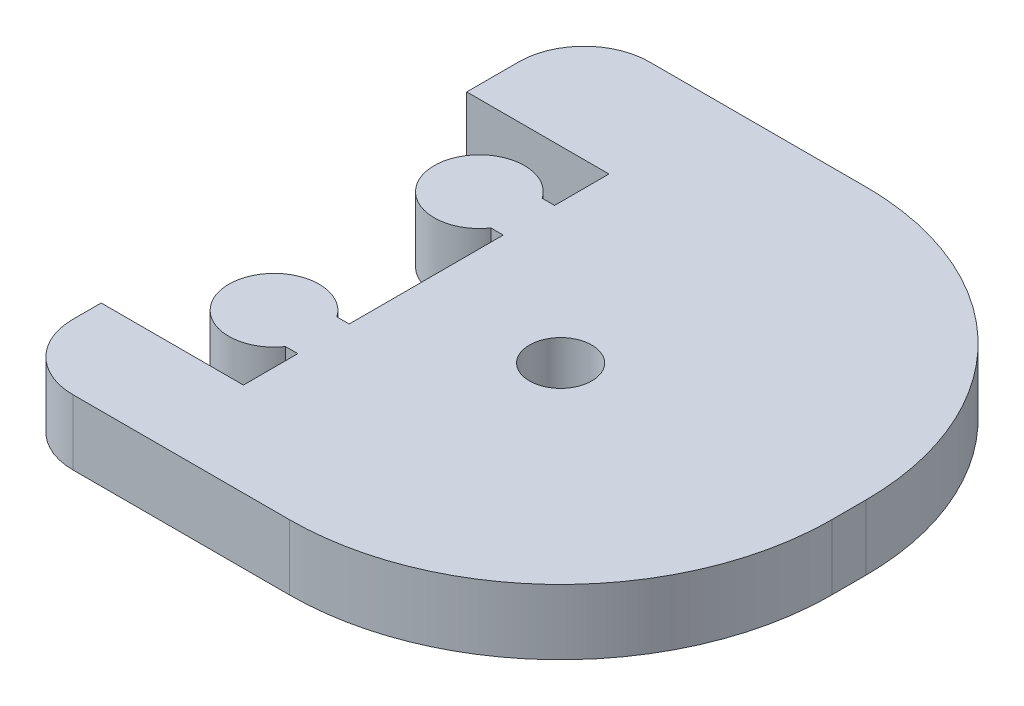
ISO-10303-21;
HEADER;
FILE_DESCRIPTION(('STEP AP214'),'2;1');
FILE_NAME('part.step','',(''),(''),'','','');
FILE_SCHEMA(('AUTOMOTIVE_DESIGN { 1 0 10303 214 1 1 1 1 }'));
ENDSEC;
DATA;
#1=APPLICATION_CONTEXT('core data for automotive mechanical design processes');
#2=APPLICATION_PROTOCOL_DEFINITION('international standard','automotive_design',2000,#1);
#3=PRODUCT_CONTEXT('',#1,'mechanical');
#4=PRODUCT('Part','Part','',(#3));
#5=PRODUCT_RELATED_PRODUCT_CATEGORY('part','',(#4));
#6=PRODUCT_DEFINITION_FORMATION('','',#4);
#7=PRODUCT_DEFINITION_CONTEXT('part definition',#1,'design');
#8=PRODUCT_DEFINITION('design','',#6,#7);
#9=PRODUCT_DEFINITION_SHAPE('','',#8);
#10=(LENGTH_UNIT() NAMED_UNIT(*) SI_UNIT(.MILLI.,.METRE.));
#11=(NAMED_UNIT(*) PLANE_ANGLE_UNIT() SI_UNIT($,.RADIAN.));
#12=(NAMED_UNIT(*) SI_UNIT($,.STERADIAN.) SOLID_ANGLE_UNIT());
#13=UNCERTAINTY_MEASURE_WITH_UNIT(LENGTH_MEASURE(1.E-05),#10,'distance_accuracy_value','');
#14=(GEOMETRIC_REPRESENTATION_CONTEXT(3) GLOBAL_UNCERTAINTY_ASSIGNED_CONTEXT((#13)) GLOBAL_UNIT_ASSIGNED_CONTEXT((#10,
#11,#12)) REPRESENTATION_CONTEXT('',''));
#15=CARTESIAN_POINT('',(0.,0.,0.));
#16=DIRECTION('',(0.,0.,1.));
#17=DIRECTION('',(1.,0.,0.));
#18=AXIS2_PLACEMENT_3D('',#15,#16,#17);
#19=CARTESIAN_POINT('',(6.11068006787094,0.,-14.0318688813477));
#20=DIRECTION('',(1.,0.,0.));
#21=DIRECTION('',(0.,0.,-1.));
#22=AXIS2_PLACEMENT_3D('',#19,#20,#21);
#23=PLANE('',#22);
#24=DIRECTION('',(0.,0.,-1.));
#25=VECTOR('',#24,1.);
#26=CARTESIAN_POINT('',(6.11068006787094,0.,-14.0318688813477));
#27=LINE('',#26,#25);
#28=CARTESIAN_POINT('',(6.11068006787095,0.,10.8601311186523));
#29=VERTEX_POINT('',#28);
#30=CARTESIAN_POINT('',(6.11068006787095,0.,9.48061562722783));
#31=VERTEX_POINT('',#30);
#32=EDGE_CURVE('E286',#29,#31,#27,.T.);
#33=ORIENTED_EDGE('',*,*,#32,.F.);
#34=DIRECTION('',(0.,1.,0.));
#35=VECTOR('',#34,1.);
#36=CARTESIAN_POINT('',(6.11068006787095,0.,10.8601311186523));
#37=LINE('',#36,#35);
#38=CARTESIAN_POINT('',(6.11068006787095,3.175,10.8601311186523));
#39=VERTEX_POINT('',#38);
#40=EDGE_CURVE('E55',#29,#39,#37,.T.);
#41=ORIENTED_EDGE('',*,*,#40,.T.);
#42=DIRECTION('',(0.,0.,-1.));
#43=VECTOR('',#42,1.);
#44=CARTESIAN_POINT('',(6.11068006787094,3.175,-14.0318688813477));
#45=LINE('',#44,#43);
#46=CARTESIAN_POINT('',(6.11068006787095,3.175,9.48061562722783));
#47=VERTEX_POINT('',#46);
#48=EDGE_CURVE('E290',#39,#47,#45,.T.);
#49=ORIENTED_EDGE('',*,*,#48,.T.);
#50=DIRECTION('',(0.,1.,0.));
#51=VECTOR('',#50,1.);
#52=CARTESIAN_POINT('',(6.11068006787095,0.,9.48061562722783));
#53=LINE('',#52,#51);
#54=EDGE_CURVE('E267',#31,#47,#53,.T.);
#55=ORIENTED_EDGE('',*,*,#54,.F.);
#56=EDGE_LOOP('',(#33,#41,#49,#55));
#57=FACE_BOUND('',#56,.T.);
#58=ADVANCED_FACE('F47',(#57),#23,.F.);
#59=CARTESIAN_POINT('',(-33.0053199321291,3.175,14.0351311186523));
#60=DIRECTION('',(0.,0.,-1.));
#61=DIRECTION('',(-1.,0.,0.));
#62=AXIS2_PLACEMENT_3D('',#59,#60,#61);
#63=PLANE('',#62);
#64=DIRECTION('',(1.,0.,0.));
#65=VECTOR('',#64,1.);
#66=CARTESIAN_POINT('',(-33.0053199321291,3.175,14.0351311186523));
#67=LINE('',#66,#65);
#68=CARTESIAN_POINT('',(9.28568006787095,3.175,14.0351311186523));
#69=VERTEX_POINT('',#68);
#70=CARTESIAN_POINT('',(19.8266800678709,3.175,14.0351311186523));
#71=VERTEX_POINT('',#70);
#72=EDGE_CURVE('E300',#69,#71,#67,.T.);
#73=ORIENTED_EDGE('',*,*,#72,.F.);
#74=DIRECTION('',(0.,1.,0.));
#75=VECTOR('',#74,1.);
#76=CARTESIAN_POINT('',(9.28568006787095,3.175,14.0351311186523));
#77=LINE('',#76,#75);
#78=CARTESIAN_POINT('',(9.28568006787095,0.,14.0351311186523));
#79=VERTEX_POINT('',#78);
#80=EDGE_CURVE('E13',#69,#79,#77,.F.);
#81=ORIENTED_EDGE('',*,*,#80,.T.);
#82=DIRECTION('',(1.,0.,0.));
#83=VECTOR('',#82,1.);
#84=CARTESIAN_POINT('',(-33.0053199321291,0.,14.0351311186523));
#85=LINE('',#84,#83);
#86=CARTESIAN_POINT('',(19.8266800678709,0.,14.0351311186523));
#87=VERTEX_POINT('',#86);
#88=EDGE_CURVE('E320',#79,#87,#85,.T.);
#89=ORIENTED_EDGE('',*,*,#88,.T.);
#90=DIRECTION('',(0.,-1.,0.));
#91=VECTOR('',#90,1.);
#92=CARTESIAN_POINT('',(19.8266800678709,3.175,14.0351311186523));
#93=LINE('',#92,#91);
#94=EDGE_CURVE('E298',#87,#71,#93,.F.);
#95=ORIENTED_EDGE('',*,*,#94,.T.);
#96=EDGE_LOOP('',(#73,#81,#89,#95));
#97=FACE_BOUND('',#96,.T.);
#98=ADVANCED_FACE('F440',(#97),#63,.F.);
#99=CARTESIAN_POINT('',(33.0346800678709,3.175,-14.0318688813477));
#100=DIRECTION('',(-1.,0.,0.));
#101=DIRECTION('',(0.,0.,1.));
#102=AXIS2_PLACEMENT_3D('',#99,#100,#101);
#103=PLANE('',#102);
#104=DIRECTION('',(0.,0.,-1.));
#105=VECTOR('',#104,1.);
#106=CARTESIAN_POINT('',(33.0346800678709,0.,-14.0318688813477));
#107=LINE('',#106,#105);
#108=CARTESIAN_POINT('',(33.0346800678709,0.,0.827131118652321));
#109=VERTEX_POINT('',#108);
#110=CARTESIAN_POINT('',(33.0346800678709,0.,-0.823868881347677));
#111=VERTEX_POINT('',#110);
#112=EDGE_CURVE('E325',#109,#111,#107,.T.);
#113=ORIENTED_EDGE('',*,*,#112,.T.);
#114=DIRECTION('',(0.,-1.,0.));
#115=VECTOR('',#114,1.);
#116=CARTESIAN_POINT('',(33.0346800678709,3.175,-0.823868881347677));
#117=LINE('',#116,#115);
#118=CARTESIAN_POINT('',(33.0346800678709,3.175,-0.823868881347677));
#119=VERTEX_POINT('',#118);
#120=EDGE_CURVE('E318',#111,#119,#117,.F.);
#121=ORIENTED_EDGE('',*,*,#120,.T.);
#122=DIRECTION('',(0.,0.,-1.));
#123=VECTOR('',#122,1.);
#124=CARTESIAN_POINT('',(33.0346800678709,3.175,-14.0318688813477));
#125=LINE('',#124,#123);
#126=CARTESIAN_POINT('',(33.0346800678709,3.175,0.827131118652321));
#127=VERTEX_POINT('',#126);
#128=EDGE_CURVE('E299',#127,#119,#125,.T.);
#129=ORIENTED_EDGE('',*,*,#128,.F.);
#130=DIRECTION('',(0.,-1.,0.));
#131=VECTOR('',#130,1.);
#132=CARTESIAN_POINT('',(33.0346800678709,3.175,0.827131118652321));
#133=LINE('',#132,#131);
#134=EDGE_CURVE('E307',#127,#109,#133,.T.);
#135=ORIENTED_EDGE('',*,*,#134,.T.);
#136=EDGE_LOOP('',(#113,#121,#129,#135));
#137=FACE_BOUND('',#136,.T.);
#138=ADVANCED_FACE('F428',(#137),#103,.F.);
#139=CARTESIAN_POINT('',(-33.0053199321291,3.175,-14.0318688813477));
#140=DIRECTION('',(0.,0.,1.));
#141=DIRECTION('',(1.,0.,0.));
#142=AXIS2_PLACEMENT_3D('',#139,#140,#141);
#143=PLANE('',#142);
#144=DIRECTION('',(-1.,0.,0.));
#145=VECTOR('',#144,1.);
#146=CARTESIAN_POINT('',(-33.0053199321291,0.,-14.0318688813477));
#147=LINE('',#146,#145);
#148=CARTESIAN_POINT('',(19.8266800678709,0.,-14.0318688813477));
#149=VERTEX_POINT('',#148);
#150=CARTESIAN_POINT('',(9.28568006787094,0.,-14.0318688813477));
#151=VERTEX_POINT('',#150);
#152=EDGE_CURVE('E302',#149,#151,#147,.T.);
#153=ORIENTED_EDGE('',*,*,#152,.T.);
#154=DIRECTION('',(0.,1.,0.));
#155=VECTOR('',#154,1.);
#156=CARTESIAN_POINT('',(9.28568006787094,3.175,-14.0318688813477));
#157=LINE('',#156,#155);
#158=CARTESIAN_POINT('',(9.28568006787094,3.175,-14.0318688813477));
#159=VERTEX_POINT('',#158);
#160=EDGE_CURVE('E349',#151,#159,#157,.T.);
#161=ORIENTED_EDGE('',*,*,#160,.T.);
#162=DIRECTION('',(-1.,0.,0.));
#163=VECTOR('',#162,1.);
#164=CARTESIAN_POINT('',(-33.0053199321291,3.175,-14.0318688813477));
#165=LINE('',#164,#163);
#166=CARTESIAN_POINT('',(19.8266800678709,3.175,-14.0318688813477));
#167=VERTEX_POINT('',#166);
#168=EDGE_CURVE('E295',#167,#159,#165,.T.);
#169=ORIENTED_EDGE('',*,*,#168,.F.);
#170=DIRECTION('',(0.,-1.,0.));
#171=VECTOR('',#170,1.);
#172=CARTESIAN_POINT('',(19.8266800678709,3.175,-14.0318688813477));
#173=LINE('',#172,#171);
#174=EDGE_CURVE('E319',#167,#149,#173,.T.);
#175=ORIENTED_EDGE('',*,*,#174,.T.);
#176=EDGE_LOOP('',(#153,#161,#169,#175));
#177=FACE_BOUND('',#176,.T.);
#178=ADVANCED_FACE('F419',(#177),#143,.F.);
#179=CARTESIAN_POINT('',(0.0146800678709314,3.175,0.0016311186523256));
#180=DIRECTION('',(0.,1.,0.));
#181=DIRECTION('',(0.,0.,1.));
#182=AXIS2_PLACEMENT_3D('',#179,#180,#181);
#183=PLANE('',#182);
#184=ORIENTED_EDGE('',*,*,#168,.T.);
#185=CARTESIAN_POINT('',(9.28568006787094,3.175,-10.8568688813477));
#186=DIRECTION('',(0.,1.,0.));
#187=DIRECTION('',(0.,0.,1.));
#188=AXIS2_PLACEMENT_3D('',#185,#186,#187);
#189=CIRCLE('',#188,3.175);
#190=CARTESIAN_POINT('',(6.11068006787094,3.175,-10.8568688813477));
#191=VERTEX_POINT('',#190);
#192=EDGE_CURVE('E358',#159,#191,#189,.T.);
#193=ORIENTED_EDGE('',*,*,#192,.T.);
#194=CARTESIAN_POINT('',(6.11068006787094,3.175,-8.31938437277217));
#195=VERTEX_POINT('',#194);
#196=EDGE_CURVE('E264',#195,#191,#45,.T.);
#197=ORIENTED_EDGE('',*,*,#196,.F.);
#198=DIRECTION('',(-1.,0.,0.));
#199=VECTOR('',#198,1.);
#200=CARTESIAN_POINT('',(13.0357920682757,3.175,-8.31938437277217));
#201=LINE('',#200,#199);
#202=CARTESIAN_POINT('',(13.0357920682757,3.175,-8.31938437277217));
#203=VERTEX_POINT('',#202);
#204=EDGE_CURVE('E258',#203,#195,#201,.T.);
#205=ORIENTED_EDGE('',*,*,#204,.F.);
#206=DIRECTION('',(0.,0.,-1.));
#207=VECTOR('',#206,1.);
#208=CARTESIAN_POINT('',(13.0357920682757,3.175,-5.66938437277216));
#209=LINE('',#208,#207);
#210=CARTESIAN_POINT('',(13.0357920682757,3.175,-5.66938437277216));
#211=VERTEX_POINT('',#210);
#212=EDGE_CURVE('E255',#211,#203,#209,.T.);
#213=ORIENTED_EDGE('',*,*,#212,.F.);
#214=DIRECTION('',(1.,0.,0.));
#215=VECTOR('',#214,1.);
#216=CARTESIAN_POINT('',(12.4357920682757,3.175,-5.66938437277216));
#217=LINE('',#216,#215);
#218=CARTESIAN_POINT('',(12.4357920682757,3.175,-5.66938437277216));
#219=VERTEX_POINT('',#218);
#220=EDGE_CURVE('E252',#219,#211,#217,.T.);
#221=ORIENTED_EDGE('',*,*,#220,.F.);
#222=CARTESIAN_POINT('',(10.6254053692526,3.175,-4.41938437277216));
#223=DIRECTION('',(0.,-1.,0.));
#224=DIRECTION('',(0.,0.,1.));
#225=AXIS2_PLACEMENT_3D('',#222,#223,#224);
#226=CIRCLE('',#225,2.2);
#227=CARTESIAN_POINT('',(12.4357920682757,3.175,-3.16938437277216));
#228=VERTEX_POINT('',#227);
#229=EDGE_CURVE('E249',#228,#219,#226,.T.);
#230=ORIENTED_EDGE('',*,*,#229,.F.);
#231=DIRECTION('',(-1.,0.,0.));
#232=VECTOR('',#231,1.);
#233=CARTESIAN_POINT('',(12.4357920682757,3.175,-3.16938437277216));
#234=LINE('',#233,#232);
#235=CARTESIAN_POINT('',(13.0357920682757,3.175,-3.16938437277216));
#236=VERTEX_POINT('',#235);
#237=EDGE_CURVE('E246',#236,#228,#234,.T.);
#238=ORIENTED_EDGE('',*,*,#237,.F.);
#239=DIRECTION('',(0.,0.,-1.));
#240=VECTOR('',#239,1.);
#241=CARTESIAN_POINT('',(13.0357920682757,3.175,-3.16938437277216));
#242=LINE('',#241,#240);
#243=CARTESIAN_POINT('',(13.0357920682758,3.175,4.33061562722784));
#244=VERTEX_POINT('',#243);
#245=EDGE_CURVE('E243',#244,#236,#242,.T.);
#246=ORIENTED_EDGE('',*,*,#245,.F.);
#247=DIRECTION('',(1.,0.,0.));
#248=VECTOR('',#247,1.);
#249=CARTESIAN_POINT('',(12.4357920682758,3.175,4.33061562722784));
#250=LINE('',#249,#248);
#251=CARTESIAN_POINT('',(12.4357920682758,3.175,4.33061562722784));
#252=VERTEX_POINT('',#251);
#253=EDGE_CURVE('E240',#252,#244,#250,.T.);
#254=ORIENTED_EDGE('',*,*,#253,.F.);
#255=CARTESIAN_POINT('',(10.6254053692526,3.175,5.58061562722785));
#256=DIRECTION('',(0.,-1.,0.));
#257=DIRECTION('',(0.,0.,1.));
#258=AXIS2_PLACEMENT_3D('',#255,#256,#257);
#259=CIRCLE('',#258,2.2);
#260=CARTESIAN_POINT('',(12.4357920682758,3.175,6.83061562722784));
#261=VERTEX_POINT('',#260);
#262=EDGE_CURVE('E238',#261,#252,#259,.T.);
#263=ORIENTED_EDGE('',*,*,#262,.F.);
#264=DIRECTION('',(-1.,0.,0.));
#265=VECTOR('',#264,1.);
#266=CARTESIAN_POINT('',(12.4357920682758,3.175,6.83061562722784));
#267=LINE('',#266,#265);
#268=CARTESIAN_POINT('',(13.0357920682758,3.175,6.83061562722784));
#269=VERTEX_POINT('',#268);
#270=EDGE_CURVE('E190',#269,#261,#267,.T.);
#271=ORIENTED_EDGE('',*,*,#270,.F.);
#272=DIRECTION('',(0.,0.,-1.));
#273=VECTOR('',#272,1.);
#274=CARTESIAN_POINT('',(13.0357920682758,3.175,6.83061562722784));
#275=LINE('',#274,#273);
#276=CARTESIAN_POINT('',(13.0357920682758,3.175,9.48061562722783));
#277=VERTEX_POINT('',#276);
#278=EDGE_CURVE('E209',#277,#269,#275,.T.);
#279=ORIENTED_EDGE('',*,*,#278,.F.);
#280=DIRECTION('',(1.,0.,0.));
#281=VECTOR('',#280,1.);
#282=CARTESIAN_POINT('',(13.0357920682758,3.175,9.48061562722783));
#283=LINE('',#282,#281);
#284=EDGE_CURVE('E212',#47,#277,#283,.T.);
#285=ORIENTED_EDGE('',*,*,#284,.F.);
#286=ORIENTED_EDGE('',*,*,#48,.F.);
#287=CARTESIAN_POINT('',(9.28568006787095,3.175,10.8601311186523));
#288=DIRECTION('',(0.,1.,0.));
#289=DIRECTION('',(0.,0.,1.));
#290=AXIS2_PLACEMENT_3D('',#287,#288,#289);
#291=CIRCLE('',#290,3.175);
#292=EDGE_CURVE('E356',#39,#69,#291,.T.);
#293=ORIENTED_EDGE('',*,*,#292,.T.);
#294=ORIENTED_EDGE('',*,*,#72,.T.);
#295=CARTESIAN_POINT('',(19.8266800678709,3.175,14.0351311186523));
#296=CARTESIAN_POINT('',(27.5637473360471,3.175,14.0351311186523));
#297=CARTESIAN_POINT('',(33.0346800678709,3.175,8.56419838682848));
#298=CARTESIAN_POINT('',(33.0346800678709,3.175,0.827131118652321));
#299=(BOUNDED_CURVE() B_SPLINE_CURVE(3,(#295,#296,#297,#298),.UNSPECIFIED.,.F.,
.F.) B_SPLINE_CURVE_WITH_KNOTS((4,4),(0.,1.),
.UNSPECIFIED.) CURVE() GEOMETRIC_REPRESENTATION_ITEM() RATIONAL_B_SPLINE_CURVE((1.,
0.804737854124365,0.804737854124365,1.)) REPRESENTATION_ITEM(''));
#300=EDGE_CURVE('E303',#71,#127,#299,.T.);
#301=ORIENTED_EDGE('',*,*,#300,.T.);
#302=ORIENTED_EDGE('',*,*,#128,.T.);
#303=CARTESIAN_POINT('',(33.0346800678709,3.175,-0.823868881347677));
#304=CARTESIAN_POINT('',(33.0346800678709,3.175,-8.56093614952383));
#305=CARTESIAN_POINT('',(27.5637473360471,3.175,-14.0318688813477));
#306=CARTESIAN_POINT('',(19.8266800678709,3.175,-14.0318688813477));
#307=(BOUNDED_CURVE() B_SPLINE_CURVE(3,(#303,#304,#305,#306),.UNSPECIFIED.,.F.,
.F.) B_SPLINE_CURVE_WITH_KNOTS((4,4),(0.,1.),
.UNSPECIFIED.) CURVE() GEOMETRIC_REPRESENTATION_ITEM() RATIONAL_B_SPLINE_CURVE((1.,
0.804737854124365,0.804737854124365,1.)) REPRESENTATION_ITEM(''));
#308=EDGE_CURVE('E314',#119,#167,#307,.T.);
#309=ORIENTED_EDGE('',*,*,#308,.T.);
#310=EDGE_LOOP('',(#184,#193,#197,#205,#213,#221,#230,#238,#246,#254,#263,#271,#279,#285,#286,
#293,#294,#301,#302,#309));
#311=FACE_BOUND('',#310,.T.);
#312=CARTESIAN_POINT('',(19.8266800678709,3.175,0.827131118652324));
#313=DIRECTION('',(0.,1.,0.));
#314=DIRECTION('',(0.,0.,1.));
#315=AXIS2_PLACEMENT_3D('',#312,#313,#314);
#316=CIRCLE('',#315,1.517269);
#317=CARTESIAN_POINT('',(19.8266800678709,3.175,2.34440011865232));
#318=VERTEX_POINT('',#317);
#319=EDGE_CURVE('E288',#318,#318,#316,.T.);
#320=ORIENTED_EDGE('',*,*,#319,.F.);
#321=EDGE_LOOP('',(#320));
#322=FACE_BOUND('',#321,.T.);
#323=ADVANCED_FACE('F372',(#311,#322),#183,.T.);
#324=CARTESIAN_POINT('',(0.0146800678709314,0.,0.0016311186523256));
#325=DIRECTION('',(0.,1.,0.));
#326=DIRECTION('',(0.,0.,1.));
#327=AXIS2_PLACEMENT_3D('',#324,#325,#326);
#328=PLANE('',#327);
#329=CARTESIAN_POINT('',(6.11068006787095,0.,-8.31938437277217));
#330=VERTEX_POINT('',#329);
#331=CARTESIAN_POINT('',(6.11068006787094,0.,-10.8568688813477));
#332=VERTEX_POINT('',#331);
#333=EDGE_CURVE('E289',#330,#332,#27,.T.);
#334=ORIENTED_EDGE('',*,*,#333,.T.);
#335=CARTESIAN_POINT('',(9.28568006787094,0.,-10.8568688813477));
#336=DIRECTION('',(0.,1.,0.));
#337=DIRECTION('',(0.,0.,1.));
#338=AXIS2_PLACEMENT_3D('',#335,#336,#337);
#339=CIRCLE('',#338,3.175);
#340=EDGE_CURVE('E363',#332,#151,#339,.F.);
#341=ORIENTED_EDGE('',*,*,#340,.T.);
#342=ORIENTED_EDGE('',*,*,#152,.F.);
#343=CARTESIAN_POINT('',(33.0346800678709,0.,-0.823868881347677));
#344=CARTESIAN_POINT('',(33.0346800678709,0.,-8.56093614952383));
#345=CARTESIAN_POINT('',(27.5637473360471,0.,-14.0318688813477));
#346=CARTESIAN_POINT('',(19.8266800678709,0.,-14.0318688813477));
#347=(BOUNDED_CURVE() B_SPLINE_CURVE(3,(#343,#344,#345,#346),.UNSPECIFIED.,.F.,
.F.) B_SPLINE_CURVE_WITH_KNOTS((4,4),(0.,1.),
.UNSPECIFIED.) CURVE() GEOMETRIC_REPRESENTATION_ITEM() RATIONAL_B_SPLINE_CURVE((1.,
0.804737854124365,0.804737854124365,1.)) REPRESENTATION_ITEM(''));
#348=EDGE_CURVE('E332',#149,#111,#347,.F.);
#349=ORIENTED_EDGE('',*,*,#348,.T.);
#350=ORIENTED_EDGE('',*,*,#112,.F.);
#351=CARTESIAN_POINT('',(19.8266800678709,0.,14.0351311186523));
#352=CARTESIAN_POINT('',(27.5637473360471,0.,14.0351311186523));
#353=CARTESIAN_POINT('',(33.0346800678709,0.,8.56419838682848));
#354=CARTESIAN_POINT('',(33.0346800678709,0.,0.827131118652321));
#355=(BOUNDED_CURVE() B_SPLINE_CURVE(3,(#351,#352,#353,#354),.UNSPECIFIED.,.F.,
.F.) B_SPLINE_CURVE_WITH_KNOTS((4,4),(0.,1.),
.UNSPECIFIED.) CURVE() GEOMETRIC_REPRESENTATION_ITEM() RATIONAL_B_SPLINE_CURVE((1.,
0.804737854124365,0.804737854124365,1.)) REPRESENTATION_ITEM(''));
#356=EDGE_CURVE('E308',#109,#87,#355,.F.);
#357=ORIENTED_EDGE('',*,*,#356,.T.);
#358=ORIENTED_EDGE('',*,*,#88,.F.);
#359=CARTESIAN_POINT('',(9.28568006787095,0.,10.8601311186523));
#360=DIRECTION('',(0.,1.,0.));
#361=DIRECTION('',(0.,0.,1.));
#362=AXIS2_PLACEMENT_3D('',#359,#360,#361);
#363=CIRCLE('',#362,3.175);
#364=EDGE_CURVE('E67',#79,#29,#363,.F.);
#365=ORIENTED_EDGE('',*,*,#364,.T.);
#366=ORIENTED_EDGE('',*,*,#32,.T.);
#367=DIRECTION('',(1.,0.,0.));
#368=VECTOR('',#367,1.);
#369=CARTESIAN_POINT('',(13.0357920682758,0.,9.48061562722783));
#370=LINE('',#369,#368);
#371=CARTESIAN_POINT('',(13.0357920682758,0.,9.48061562722783));
#372=VERTEX_POINT('',#371);
#373=EDGE_CURVE('E234',#31,#372,#370,.T.);
#374=ORIENTED_EDGE('',*,*,#373,.T.);
#375=DIRECTION('',(0.,0.,-1.));
#376=VECTOR('',#375,1.);
#377=CARTESIAN_POINT('',(13.0357920682758,0.,6.83061562722784));
#378=LINE('',#377,#376);
#379=CARTESIAN_POINT('',(13.0357920682758,0.,6.83061562722784));
#380=VERTEX_POINT('',#379);
#381=EDGE_CURVE('E195',#372,#380,#378,.T.);
#382=ORIENTED_EDGE('',*,*,#381,.T.);
#383=DIRECTION('',(-1.,0.,0.));
#384=VECTOR('',#383,1.);
#385=CARTESIAN_POINT('',(12.4357920682758,0.,6.83061562722784));
#386=LINE('',#385,#384);
#387=CARTESIAN_POINT('',(12.4357920682758,0.,6.83061562722784));
#388=VERTEX_POINT('',#387);
#389=EDGE_CURVE('E187',#380,#388,#386,.T.);
#390=ORIENTED_EDGE('',*,*,#389,.T.);
#391=CARTESIAN_POINT('',(10.6254053692526,0.,5.58061562722785));
#392=DIRECTION('',(0.,-1.,0.));
#393=DIRECTION('',(0.,0.,1.));
#394=AXIS2_PLACEMENT_3D('',#391,#392,#393);
#395=CIRCLE('',#394,2.2);
#396=CARTESIAN_POINT('',(12.4357920682758,0.,4.33061562722784));
#397=VERTEX_POINT('',#396);
#398=EDGE_CURVE('E198',#388,#397,#395,.T.);
#399=ORIENTED_EDGE('',*,*,#398,.T.);
#400=DIRECTION('',(1.,0.,0.));
#401=VECTOR('',#400,1.);
#402=CARTESIAN_POINT('',(12.4357920682758,0.,4.33061562722784));
#403=LINE('',#402,#401);
#404=CARTESIAN_POINT('',(13.0357920682758,0.,4.33061562722784));
#405=VERTEX_POINT('',#404);
#406=EDGE_CURVE('E202',#397,#405,#403,.T.);
#407=ORIENTED_EDGE('',*,*,#406,.T.);
#408=DIRECTION('',(0.,0.,-1.));
#409=VECTOR('',#408,1.);
#410=CARTESIAN_POINT('',(13.0357920682757,0.,-3.16938437277216));
#411=LINE('',#410,#409);
#412=CARTESIAN_POINT('',(13.0357920682757,0.,-3.16938437277216));
#413=VERTEX_POINT('',#412);
#414=EDGE_CURVE('E216',#405,#413,#411,.T.);
#415=ORIENTED_EDGE('',*,*,#414,.T.);
#416=DIRECTION('',(-1.,0.,0.));
#417=VECTOR('',#416,1.);
#418=CARTESIAN_POINT('',(12.4357920682757,0.,-3.16938437277216));
#419=LINE('',#418,#417);
#420=CARTESIAN_POINT('',(12.4357920682757,0.,-3.16938437277216));
#421=VERTEX_POINT('',#420);
#422=EDGE_CURVE('E219',#413,#421,#419,.T.);
#423=ORIENTED_EDGE('',*,*,#422,.T.);
#424=CARTESIAN_POINT('',(10.6254053692526,0.,-4.41938437277216));
#425=DIRECTION('',(0.,-1.,0.));
#426=DIRECTION('',(0.,0.,1.));
#427=AXIS2_PLACEMENT_3D('',#424,#425,#426);
#428=CIRCLE('',#427,2.2);
#429=CARTESIAN_POINT('',(12.4357920682757,0.,-5.66938437277216));
#430=VERTEX_POINT('',#429);
#431=EDGE_CURVE('E222',#421,#430,#428,.T.);
#432=ORIENTED_EDGE('',*,*,#431,.T.);
#433=DIRECTION('',(1.,0.,0.));
#434=VECTOR('',#433,1.);
#435=CARTESIAN_POINT('',(12.4357920682757,0.,-5.66938437277216));
#436=LINE('',#435,#434);
#437=CARTESIAN_POINT('',(13.0357920682757,0.,-5.66938437277216));
#438=VERTEX_POINT('',#437);
#439=EDGE_CURVE('E225',#430,#438,#436,.T.);
#440=ORIENTED_EDGE('',*,*,#439,.T.);
#441=DIRECTION('',(0.,0.,-1.));
#442=VECTOR('',#441,1.);
#443=CARTESIAN_POINT('',(13.0357920682757,0.,-5.66938437277216));
#444=LINE('',#443,#442);
#445=CARTESIAN_POINT('',(13.0357920682757,0.,-8.31938437277217));
#446=VERTEX_POINT('',#445);
#447=EDGE_CURVE('E228',#438,#446,#444,.T.);
#448=ORIENTED_EDGE('',*,*,#447,.T.);
#449=DIRECTION('',(-1.,0.,0.));
#450=VECTOR('',#449,1.);
#451=CARTESIAN_POINT('',(13.0357920682757,0.,-8.31938437277217));
#452=LINE('',#451,#450);
#453=EDGE_CURVE('E231',#446,#330,#452,.T.);
#454=ORIENTED_EDGE('',*,*,#453,.T.);
#455=EDGE_LOOP('',(#334,#341,#342,#349,#350,#357,#358,#365,#366,#374,#382,#390,#399,#407,#415,
#423,#432,#440,#448,#454));
#456=FACE_BOUND('',#455,.T.);
#457=CARTESIAN_POINT('',(19.8266800678709,0.,0.827131118652324));
#458=DIRECTION('',(0.,1.,0.));
#459=DIRECTION('',(0.,0.,1.));
#460=AXIS2_PLACEMENT_3D('',#457,#458,#459);
#461=CIRCLE('',#460,1.517269);
#462=CARTESIAN_POINT('',(19.8266800678709,0.,2.34440011865232));
#463=VERTEX_POINT('',#462);
#464=EDGE_CURVE('E294',#463,#463,#461,.T.);
#465=ORIENTED_EDGE('',*,*,#464,.T.);
#466=EDGE_LOOP('',(#465));
#467=FACE_BOUND('',#466,.T.);
#468=ADVANCED_FACE('F205',(#456,#467),#328,.F.);
#469=CARTESIAN_POINT('',(19.8266800678709,3.175,0.827131118652324));
#470=DIRECTION('',(0.,-1.,0.));
#471=DIRECTION('',(0.,0.,-1.));
#472=AXIS2_PLACEMENT_3D('',#469,#470,#471);
#473=CYLINDRICAL_SURFACE('',#472,13.208);
#474=ORIENTED_EDGE('',*,*,#300,.F.);
#475=ORIENTED_EDGE('',*,*,#94,.F.);
#476=ORIENTED_EDGE('',*,*,#356,.F.);
#477=ORIENTED_EDGE('',*,*,#134,.F.);
#478=EDGE_LOOP('',(#474,#475,#476,#477));
#479=FACE_BOUND('',#478,.T.);
#480=ADVANCED_FACE('F433',(#479),#473,.T.);
#481=CARTESIAN_POINT('',(19.8266800678709,0.,0.827131118652324));
#482=DIRECTION('',(0.,1.,0.));
#483=DIRECTION('',(0.,0.,1.));
#484=AXIS2_PLACEMENT_3D('',#481,#482,#483);
#485=CYLINDRICAL_SURFACE('',#484,1.517269);
#486=ORIENTED_EDGE('',*,*,#464,.F.);
#487=EDGE_LOOP('',(#486));
#488=FACE_BOUND('',#487,.T.);
#489=ORIENTED_EDGE('',*,*,#319,.T.);
#490=EDGE_LOOP('',(#489));
#491=FACE_BOUND('',#490,.T.);
#492=ADVANCED_FACE('F452',(#488,#491),#485,.F.);
#493=CARTESIAN_POINT('',(19.8266800678709,3.175,-0.823868881347674));
#494=DIRECTION('',(0.,-1.,0.));
#495=DIRECTION('',(0.,0.,-1.));
#496=AXIS2_PLACEMENT_3D('',#493,#494,#495);
#497=CYLINDRICAL_SURFACE('',#496,13.208);
#498=ORIENTED_EDGE('',*,*,#308,.F.);
#499=ORIENTED_EDGE('',*,*,#120,.F.);
#500=ORIENTED_EDGE('',*,*,#348,.F.);
#501=ORIENTED_EDGE('',*,*,#174,.F.);
#502=EDGE_LOOP('',(#498,#499,#500,#501));
#503=FACE_BOUND('',#502,.T.);
#504=ADVANCED_FACE('F424',(#503),#497,.T.);
#505=ORIENTED_EDGE('',*,*,#196,.T.);
#506=DIRECTION('',(0.,1.,0.));
#507=VECTOR('',#506,1.);
#508=CARTESIAN_POINT('',(6.11068006787094,0.,-10.8568688813477));
#509=LINE('',#508,#507);
#510=EDGE_CURVE('E360',#191,#332,#509,.F.);
#511=ORIENTED_EDGE('',*,*,#510,.T.);
#512=ORIENTED_EDGE('',*,*,#333,.F.);
#513=DIRECTION('',(0.,1.,0.));
#514=VECTOR('',#513,1.);
#515=CARTESIAN_POINT('',(6.11068006787095,0.,-8.31938437277217));
#516=LINE('',#515,#514);
#517=EDGE_CURVE('E270',#330,#195,#516,.T.);
#518=ORIENTED_EDGE('',*,*,#517,.T.);
#519=EDGE_LOOP('',(#505,#511,#512,#518));
#520=FACE_BOUND('',#519,.T.);
#521=ADVANCED_FACE('F411',(#520),#23,.F.);
#522=CARTESIAN_POINT('',(12.4357920682758,0.,6.83061562722784));
#523=DIRECTION('',(0.,0.,-1.));
#524=DIRECTION('',(-1.,0.,0.));
#525=AXIS2_PLACEMENT_3D('',#522,#523,#524);
#526=PLANE('',#525);
#527=ORIENTED_EDGE('',*,*,#270,.T.);
#528=DIRECTION('',(0.,1.,0.));
#529=VECTOR('',#528,1.);
#530=CARTESIAN_POINT('',(12.4357920682758,0.,6.83061562722784));
#531=LINE('',#530,#529);
#532=EDGE_CURVE('E183',#388,#261,#531,.T.);
#533=ORIENTED_EDGE('',*,*,#532,.F.);
#534=ORIENTED_EDGE('',*,*,#389,.F.);
#535=DIRECTION('',(0.,1.,0.));
#536=VECTOR('',#535,1.);
#537=CARTESIAN_POINT('',(13.0357920682758,0.,6.83061562722784));
#538=LINE('',#537,#536);
#539=EDGE_CURVE('E262',#380,#269,#538,.T.);
#540=ORIENTED_EDGE('',*,*,#539,.T.);
#541=EDGE_LOOP('',(#527,#533,#534,#540));
#542=FACE_BOUND('',#541,.T.);
#543=ADVANCED_FACE('F185',(#542),#526,.F.);
#544=CARTESIAN_POINT('',(13.0357920682758,0.,6.83061562722784));
#545=DIRECTION('',(1.,0.,0.));
#546=DIRECTION('',(0.,0.,-1.));
#547=AXIS2_PLACEMENT_3D('',#544,#545,#546);
#548=PLANE('',#547);
#549=ORIENTED_EDGE('',*,*,#278,.T.);
#550=ORIENTED_EDGE('',*,*,#539,.F.);
#551=ORIENTED_EDGE('',*,*,#381,.F.);
#552=DIRECTION('',(0.,1.,0.));
#553=VECTOR('',#552,1.);
#554=CARTESIAN_POINT('',(13.0357920682758,0.,9.48061562722783));
#555=LINE('',#554,#553);
#556=EDGE_CURVE('E265',#372,#277,#555,.T.);
#557=ORIENTED_EDGE('',*,*,#556,.T.);
#558=EDGE_LOOP('',(#549,#550,#551,#557));
#559=FACE_BOUND('',#558,.T.);
#560=ADVANCED_FACE('F379',(#559),#548,.F.);
#561=CARTESIAN_POINT('',(13.0357920682758,0.,9.48061562722783));
#562=DIRECTION('',(0.,0.,1.));
#563=DIRECTION('',(1.,0.,0.));
#564=AXIS2_PLACEMENT_3D('',#561,#562,#563);
#565=PLANE('',#564);
#566=ORIENTED_EDGE('',*,*,#284,.T.);
#567=ORIENTED_EDGE('',*,*,#556,.F.);
#568=ORIENTED_EDGE('',*,*,#373,.F.);
#569=ORIENTED_EDGE('',*,*,#54,.T.);
#570=EDGE_LOOP('',(#566,#567,#568,#569));
#571=FACE_BOUND('',#570,.T.);
#572=ADVANCED_FACE('F376',(#571),#565,.F.);
#573=CARTESIAN_POINT('',(13.0357920682757,0.,-8.31938437277217));
#574=DIRECTION('',(0.,0.,-1.));
#575=DIRECTION('',(-1.,0.,0.));
#576=AXIS2_PLACEMENT_3D('',#573,#574,#575);
#577=PLANE('',#576);
#578=ORIENTED_EDGE('',*,*,#204,.T.);
#579=ORIENTED_EDGE('',*,*,#517,.F.);
#580=ORIENTED_EDGE('',*,*,#453,.F.);
#581=DIRECTION('',(0.,1.,0.));
#582=VECTOR('',#581,1.);
#583=CARTESIAN_POINT('',(13.0357920682757,0.,-8.31938437277217));
#584=LINE('',#583,#582);
#585=EDGE_CURVE('E273',#446,#203,#584,.T.);
#586=ORIENTED_EDGE('',*,*,#585,.T.);
#587=EDGE_LOOP('',(#578,#579,#580,#586));
#588=FACE_BOUND('',#587,.T.);
#589=ADVANCED_FACE('F406',(#588),#577,.F.);
#590=CARTESIAN_POINT('',(13.0357920682757,0.,-5.66938437277216));
#591=DIRECTION('',(1.,0.,0.));
#592=DIRECTION('',(0.,0.,-1.));
#593=AXIS2_PLACEMENT_3D('',#590,#591,#592);
#594=PLANE('',#593);
#595=ORIENTED_EDGE('',*,*,#212,.T.);
#596=ORIENTED_EDGE('',*,*,#585,.F.);
#597=ORIENTED_EDGE('',*,*,#447,.F.);
#598=DIRECTION('',(0.,1.,0.));
#599=VECTOR('',#598,1.);
#600=CARTESIAN_POINT('',(13.0357920682757,0.,-5.66938437277216));
#601=LINE('',#600,#599);
#602=EDGE_CURVE('E275',#438,#211,#601,.T.);
#603=ORIENTED_EDGE('',*,*,#602,.T.);
#604=EDGE_LOOP('',(#595,#596,#597,#603));
#605=FACE_BOUND('',#604,.T.);
#606=ADVANCED_FACE('F402',(#605),#594,.F.);
#607=CARTESIAN_POINT('',(12.4357920682757,0.,-5.66938437277216));
#608=DIRECTION('',(0.,0.,1.));
#609=DIRECTION('',(1.,0.,0.));
#610=AXIS2_PLACEMENT_3D('',#607,#608,#609);
#611=PLANE('',#610);
#612=ORIENTED_EDGE('',*,*,#220,.T.);
#613=ORIENTED_EDGE('',*,*,#602,.F.);
#614=ORIENTED_EDGE('',*,*,#439,.F.);
#615=DIRECTION('',(0.,1.,0.));
#616=VECTOR('',#615,1.);
#617=CARTESIAN_POINT('',(12.4357920682757,0.,-5.66938437277216));
#618=LINE('',#617,#616);
#619=EDGE_CURVE('E277',#430,#219,#618,.T.);
#620=ORIENTED_EDGE('',*,*,#619,.T.);
#621=EDGE_LOOP('',(#612,#613,#614,#620));
#622=FACE_BOUND('',#621,.T.);
#623=ADVANCED_FACE('F398',(#622),#611,.F.);
#624=CARTESIAN_POINT('',(10.6254053692526,0.,-4.41938437277216));
#625=DIRECTION('',(0.,1.,0.));
#626=DIRECTION('',(0.,0.,1.));
#627=AXIS2_PLACEMENT_3D('',#624,#625,#626);
#628=CYLINDRICAL_SURFACE('',#627,2.2);
#629=ORIENTED_EDGE('',*,*,#229,.T.);
#630=ORIENTED_EDGE('',*,*,#619,.F.);
#631=ORIENTED_EDGE('',*,*,#431,.F.);
#632=DIRECTION('',(0.,1.,0.));
#633=VECTOR('',#632,1.);
#634=CARTESIAN_POINT('',(12.4357920682757,0.,-3.16938437277216));
#635=LINE('',#634,#633);
#636=EDGE_CURVE('E279',#421,#228,#635,.T.);
#637=ORIENTED_EDGE('',*,*,#636,.T.);
#638=EDGE_LOOP('',(#629,#630,#631,#637));
#639=FACE_BOUND('',#638,.T.);
#640=ADVANCED_FACE('F394',(#639),#628,.T.);
#641=CARTESIAN_POINT('',(12.4357920682757,0.,-3.16938437277216));
#642=DIRECTION('',(0.,0.,-1.));
#643=DIRECTION('',(-1.,0.,0.));
#644=AXIS2_PLACEMENT_3D('',#641,#642,#643);
#645=PLANE('',#644);
#646=ORIENTED_EDGE('',*,*,#237,.T.);
#647=ORIENTED_EDGE('',*,*,#636,.F.);
#648=ORIENTED_EDGE('',*,*,#422,.F.);
#649=DIRECTION('',(0.,1.,0.));
#650=VECTOR('',#649,1.);
#651=CARTESIAN_POINT('',(13.0357920682757,0.,-3.16938437277216));
#652=LINE('',#651,#650);
#653=EDGE_CURVE('E281',#413,#236,#652,.T.);
#654=ORIENTED_EDGE('',*,*,#653,.T.);
#655=EDGE_LOOP('',(#646,#647,#648,#654));
#656=FACE_BOUND('',#655,.T.);
#657=ADVANCED_FACE('F390',(#656),#645,.F.);
#658=CARTESIAN_POINT('',(13.0357920682757,0.,-3.16938437277216));
#659=DIRECTION('',(1.,0.,0.));
#660=DIRECTION('',(0.,0.,-1.));
#661=AXIS2_PLACEMENT_3D('',#658,#659,#660);
#662=PLANE('',#661);
#663=ORIENTED_EDGE('',*,*,#245,.T.);
#664=ORIENTED_EDGE('',*,*,#653,.F.);
#665=ORIENTED_EDGE('',*,*,#414,.F.);
#666=DIRECTION('',(0.,1.,0.));
#667=VECTOR('',#666,1.);
#668=CARTESIAN_POINT('',(13.0357920682758,0.,4.33061562722784));
#669=LINE('',#668,#667);
#670=EDGE_CURVE('E283',#405,#244,#669,.T.);
#671=ORIENTED_EDGE('',*,*,#670,.T.);
#672=EDGE_LOOP('',(#663,#664,#665,#671));
#673=FACE_BOUND('',#672,.T.);
#674=ADVANCED_FACE('F388',(#673),#662,.F.);
#675=CARTESIAN_POINT('',(12.4357920682758,0.,4.33061562722784));
#676=DIRECTION('',(0.,0.,1.));
#677=DIRECTION('',(1.,0.,0.));
#678=AXIS2_PLACEMENT_3D('',#675,#676,#677);
#679=PLANE('',#678);
#680=ORIENTED_EDGE('',*,*,#253,.T.);
#681=ORIENTED_EDGE('',*,*,#670,.F.);
#682=ORIENTED_EDGE('',*,*,#406,.F.);
#683=DIRECTION('',(0.,1.,0.));
#684=VECTOR('',#683,1.);
#685=CARTESIAN_POINT('',(12.4357920682758,0.,4.33061562722784));
#686=LINE('',#685,#684);
#687=EDGE_CURVE('E194',#397,#252,#686,.T.);
#688=ORIENTED_EDGE('',*,*,#687,.T.);
#689=EDGE_LOOP('',(#680,#681,#682,#688));
#690=FACE_BOUND('',#689,.T.);
#691=ADVANCED_FACE('F384',(#690),#679,.F.);
#692=CARTESIAN_POINT('',(10.6254053692526,0.,5.58061562722785));
#693=DIRECTION('',(0.,1.,0.));
#694=DIRECTION('',(0.,0.,1.));
#695=AXIS2_PLACEMENT_3D('',#692,#693,#694);
#696=CYLINDRICAL_SURFACE('',#695,2.2);
#697=ORIENTED_EDGE('',*,*,#262,.T.);
#698=ORIENTED_EDGE('',*,*,#687,.F.);
#699=ORIENTED_EDGE('',*,*,#398,.F.);
#700=ORIENTED_EDGE('',*,*,#532,.T.);
#701=EDGE_LOOP('',(#697,#698,#699,#700));
#702=FACE_BOUND('',#701,.T.);
#703=ADVANCED_FACE('F199',(#702),#696,.T.);
#704=CARTESIAN_POINT('',(9.28568006787094,3.175,-10.8568688813477));
#705=DIRECTION('',(0.,1.,0.));
#706=DIRECTION('',(0.,0.,1.));
#707=AXIS2_PLACEMENT_3D('',#704,#705,#706);
#708=CYLINDRICAL_SURFACE('',#707,3.175);
#709=ORIENTED_EDGE('',*,*,#340,.F.);
#710=ORIENTED_EDGE('',*,*,#510,.F.);
#711=ORIENTED_EDGE('',*,*,#192,.F.);
#712=ORIENTED_EDGE('',*,*,#160,.F.);
#713=EDGE_LOOP('',(#709,#710,#711,#712));
#714=FACE_BOUND('',#713,.T.);
#715=ADVANCED_FACE('F415',(#714),#708,.T.);
#716=CARTESIAN_POINT('',(9.28568006787095,0.,10.8601311186523));
#717=DIRECTION('',(0.,1.,0.));
#718=DIRECTION('',(0.,0.,1.));
#719=AXIS2_PLACEMENT_3D('',#716,#717,#718);
#720=CYLINDRICAL_SURFACE('',#719,3.175);
#721=ORIENTED_EDGE('',*,*,#364,.F.);
#722=ORIENTED_EDGE('',*,*,#80,.F.);
#723=ORIENTED_EDGE('',*,*,#292,.F.);
#724=ORIENTED_EDGE('',*,*,#40,.F.);
#725=EDGE_LOOP('',(#721,#722,#723,#724));
#726=FACE_BOUND('',#725,.T.);
#727=ADVANCED_FACE('F49',(#726),#720,.T.);
#728=CLOSED_SHELL('',(#58,#98,#138,#178,#323,#468,#480,#492,#504,#521,#543,#560,#572,#589,#606,
#623,#640,#657,#674,#691,#703,#715,#727));
#729=MANIFOLD_SOLID_BREP('B2',#728);
#730=ADVANCED_BREP_SHAPE_REPRESENTATION('',(#18,#729),#14);
#731=SHAPE_DEFINITION_REPRESENTATION(#9,#730);
ENDSEC;
END-ISO-10303-21;
